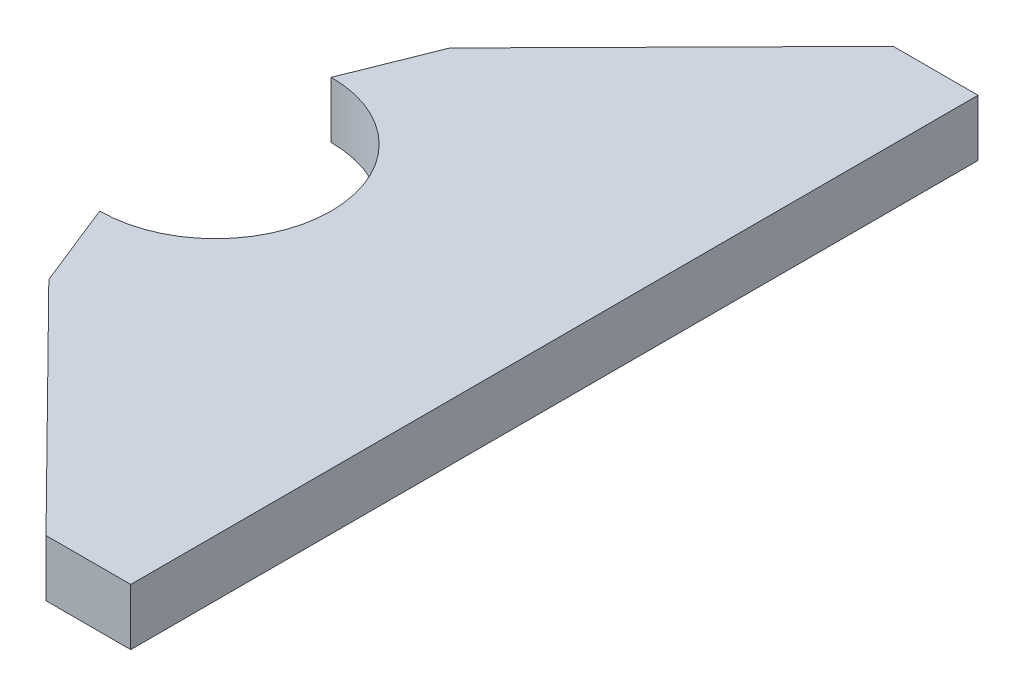
ISO-10303-21;
HEADER;
FILE_DESCRIPTION(('STEP AP214'),'2;1');
FILE_NAME('part.step','',(''),(''),'','','');
FILE_SCHEMA(('AUTOMOTIVE_DESIGN { 1 0 10303 214 1 1 1 1 }'));
ENDSEC;
DATA;
#1=APPLICATION_CONTEXT('core data for automotive mechanical design processes');
#2=APPLICATION_PROTOCOL_DEFINITION('international standard','automotive_design',2000,#1);
#3=PRODUCT_CONTEXT('',#1,'mechanical');
#4=PRODUCT('Part','Part','',(#3));
#5=PRODUCT_RELATED_PRODUCT_CATEGORY('part','',(#4));
#6=PRODUCT_DEFINITION_FORMATION('','',#4);
#7=PRODUCT_DEFINITION_CONTEXT('part definition',#1,'design');
#8=PRODUCT_DEFINITION('design','',#6,#7);
#9=PRODUCT_DEFINITION_SHAPE('','',#8);
#10=(LENGTH_UNIT() NAMED_UNIT(*) SI_UNIT(.MILLI.,.METRE.));
#11=(NAMED_UNIT(*) PLANE_ANGLE_UNIT() SI_UNIT($,.RADIAN.));
#12=(NAMED_UNIT(*) SI_UNIT($,.STERADIAN.) SOLID_ANGLE_UNIT());
#13=UNCERTAINTY_MEASURE_WITH_UNIT(LENGTH_MEASURE(1.E-05),#10,'distance_accuracy_value','');
#14=(GEOMETRIC_REPRESENTATION_CONTEXT(3) GLOBAL_UNCERTAINTY_ASSIGNED_CONTEXT((#13)) GLOBAL_UNIT_ASSIGNED_CONTEXT((#10,
#11,#12)) REPRESENTATION_CONTEXT('',''));
#15=CARTESIAN_POINT('',(0.,0.,0.));
#16=DIRECTION('',(0.,0.,1.));
#17=DIRECTION('',(1.,0.,0.));
#18=AXIS2_PLACEMENT_3D('',#15,#16,#17);
#19=CARTESIAN_POINT('',(56.5537084398977,10.,75.));
#20=DIRECTION('',(-1.,0.,0.));
#21=DIRECTION('',(0.,0.,1.));
#22=AXIS2_PLACEMENT_3D('',#19,#20,#21);
#23=PLANE('',#22);
#24=DIRECTION('',(0.,0.,-1.));
#25=VECTOR('',#24,1.);
#26=CARTESIAN_POINT('',(56.5537084398977,0.,75.));
#27=LINE('',#26,#25);
#28=CARTESIAN_POINT('',(56.5537084398977,0.,75.));
#29=VERTEX_POINT('',#28);
#30=CARTESIAN_POINT('',(56.5537084398977,0.,-75.));
#31=VERTEX_POINT('',#30);
#32=EDGE_CURVE('E130',#29,#31,#27,.T.);
#33=ORIENTED_EDGE('',*,*,#32,.T.);
#34=DIRECTION('',(0.,-1.,0.));
#35=VECTOR('',#34,1.);
#36=CARTESIAN_POINT('',(56.5537084398977,10.,-75.));
#37=LINE('',#36,#35);
#38=CARTESIAN_POINT('',(56.5537084398977,10.,-75.));
#39=VERTEX_POINT('',#38);
#40=EDGE_CURVE('E11',#39,#31,#37,.T.);
#41=ORIENTED_EDGE('',*,*,#40,.F.);
#42=DIRECTION('',(0.,0.,-1.));
#43=VECTOR('',#42,1.);
#44=CARTESIAN_POINT('',(56.5537084398977,10.,75.));
#45=LINE('',#44,#43);
#46=CARTESIAN_POINT('',(56.5537084398977,10.,75.));
#47=VERTEX_POINT('',#46);
#48=EDGE_CURVE('E144',#47,#39,#45,.T.);
#49=ORIENTED_EDGE('',*,*,#48,.F.);
#50=DIRECTION('',(0.,-1.,0.));
#51=VECTOR('',#50,1.);
#52=CARTESIAN_POINT('',(56.5537084398977,10.,75.));
#53=LINE('',#52,#51);
#54=EDGE_CURVE('E126',#47,#29,#53,.T.);
#55=ORIENTED_EDGE('',*,*,#54,.T.);
#56=EDGE_LOOP('',(#33,#41,#49,#55));
#57=FACE_BOUND('',#56,.T.);
#58=ADVANCED_FACE('F34',(#57),#23,.F.);
#59=CARTESIAN_POINT('',(41.5537084398977,10.,-75.));
#60=DIRECTION('',(0.,0.,1.));
#61=DIRECTION('',(1.,0.,0.));
#62=AXIS2_PLACEMENT_3D('',#59,#60,#61);
#63=PLANE('',#62);
#64=DIRECTION('',(-1.,0.,0.));
#65=VECTOR('',#64,1.);
#66=CARTESIAN_POINT('',(41.5537084398977,0.,-75.));
#67=LINE('',#66,#65);
#68=CARTESIAN_POINT('',(41.5537084398977,0.,-75.));
#69=VERTEX_POINT('',#68);
#70=EDGE_CURVE('E133',#31,#69,#67,.T.);
#71=ORIENTED_EDGE('',*,*,#70,.T.);
#72=DIRECTION('',(0.,-1.,0.));
#73=VECTOR('',#72,1.);
#74=CARTESIAN_POINT('',(41.5537084398977,10.,-75.));
#75=LINE('',#74,#73);
#76=CARTESIAN_POINT('',(41.5537084398977,10.,-75.));
#77=VERTEX_POINT('',#76);
#78=EDGE_CURVE('E42',#77,#69,#75,.T.);
#79=ORIENTED_EDGE('',*,*,#78,.F.);
#80=DIRECTION('',(-1.,0.,0.));
#81=VECTOR('',#80,1.);
#82=CARTESIAN_POINT('',(41.5537084398977,10.,-75.));
#83=LINE('',#82,#81);
#84=EDGE_CURVE('E93',#39,#77,#83,.T.);
#85=ORIENTED_EDGE('',*,*,#84,.F.);
#86=ORIENTED_EDGE('',*,*,#40,.T.);
#87=EDGE_LOOP('',(#71,#79,#85,#86));
#88=FACE_BOUND('',#87,.T.);
#89=ADVANCED_FACE('F179',(#88),#63,.F.);
#90=CARTESIAN_POINT('',(2.5537084398977,10.,-35.5));
#91=DIRECTION('',(0.711596211595451,0.,0.70258866461323));
#92=DIRECTION('',(0.70258866461323,0.,-0.711596211595451));
#93=AXIS2_PLACEMENT_3D('',#90,#91,#92);
#94=PLANE('',#93);
#95=DIRECTION('',(-0.70258866461323,0.,0.711596211595451));
#96=VECTOR('',#95,1.);
#97=CARTESIAN_POINT('',(2.5537084398977,0.,-35.5));
#98=LINE('',#97,#96);
#99=CARTESIAN_POINT('',(2.5537084398977,0.,-35.5));
#100=VERTEX_POINT('',#99);
#101=EDGE_CURVE('E135',#69,#100,#98,.T.);
#102=ORIENTED_EDGE('',*,*,#101,.T.);
#103=DIRECTION('',(0.,-1.,0.));
#104=VECTOR('',#103,1.);
#105=CARTESIAN_POINT('',(2.5537084398977,10.,-35.5));
#106=LINE('',#105,#104);
#107=CARTESIAN_POINT('',(2.5537084398977,10.,-35.5));
#108=VERTEX_POINT('',#107);
#109=EDGE_CURVE('E151',#108,#100,#106,.T.);
#110=ORIENTED_EDGE('',*,*,#109,.F.);
#111=DIRECTION('',(-0.70258866461323,0.,0.711596211595451));
#112=VECTOR('',#111,1.);
#113=CARTESIAN_POINT('',(2.5537084398977,10.,-35.5));
#114=LINE('',#113,#112);
#115=EDGE_CURVE('E159',#77,#108,#114,.T.);
#116=ORIENTED_EDGE('',*,*,#115,.F.);
#117=ORIENTED_EDGE('',*,*,#78,.T.);
#118=EDGE_LOOP('',(#102,#110,#116,#117));
#119=FACE_BOUND('',#118,.T.);
#120=ADVANCED_FACE('F157',(#119),#94,.F.);
#121=CARTESIAN_POINT('',(-3.4462915601023,10.,-20.5));
#122=DIRECTION('',(0.928476690885259,0.,0.371390676354104));
#123=DIRECTION('',(0.371390676354104,0.,-0.928476690885259));
#124=AXIS2_PLACEMENT_3D('',#121,#122,#123);
#125=PLANE('',#124);
#126=DIRECTION('',(-0.371390676354104,0.,0.928476690885259));
#127=VECTOR('',#126,1.);
#128=CARTESIAN_POINT('',(-3.4462915601023,0.,-20.5));
#129=LINE('',#128,#127);
#130=CARTESIAN_POINT('',(-3.4462915601023,0.,-20.5));
#131=VERTEX_POINT('',#130);
#132=EDGE_CURVE('E137',#100,#131,#129,.T.);
#133=ORIENTED_EDGE('',*,*,#132,.T.);
#134=DIRECTION('',(0.,-1.,0.));
#135=VECTOR('',#134,1.);
#136=CARTESIAN_POINT('',(-3.4462915601023,10.,-20.5));
#137=LINE('',#136,#135);
#138=CARTESIAN_POINT('',(-3.4462915601023,10.,-20.5));
#139=VERTEX_POINT('',#138);
#140=EDGE_CURVE('E148',#139,#131,#137,.T.);
#141=ORIENTED_EDGE('',*,*,#140,.F.);
#142=DIRECTION('',(-0.371390676354104,0.,0.928476690885259));
#143=VECTOR('',#142,1.);
#144=CARTESIAN_POINT('',(-3.4462915601023,10.,-20.5));
#145=LINE('',#144,#143);
#146=EDGE_CURVE('E171',#108,#139,#145,.T.);
#147=ORIENTED_EDGE('',*,*,#146,.F.);
#148=ORIENTED_EDGE('',*,*,#109,.T.);
#149=EDGE_LOOP('',(#133,#141,#147,#148));
#150=FACE_BOUND('',#149,.T.);
#151=ADVANCED_FACE('F167',(#150),#125,.F.);
#152=CARTESIAN_POINT('',(-3.4462915601023,10.,0.));
#153=DIRECTION('',(0.,-1.,0.));
#154=DIRECTION('',(0.,0.,-1.));
#155=AXIS2_PLACEMENT_3D('',#152,#153,#154);
#156=CYLINDRICAL_SURFACE('',#155,20.5);
#157=CARTESIAN_POINT('',(-3.4462915601023,0.,0.));
#158=DIRECTION('',(0.,-1.,0.));
#159=DIRECTION('',(0.,0.,1.));
#160=AXIS2_PLACEMENT_3D('',#157,#158,#159);
#161=CIRCLE('',#160,20.5);
#162=CARTESIAN_POINT('',(-3.4462915601023,0.,20.5));
#163=VERTEX_POINT('',#162);
#164=EDGE_CURVE('E139',#131,#163,#161,.T.);
#165=ORIENTED_EDGE('',*,*,#164,.T.);
#166=DIRECTION('',(0.,-1.,0.));
#167=VECTOR('',#166,1.);
#168=CARTESIAN_POINT('',(-3.4462915601023,10.,20.5));
#169=LINE('',#168,#167);
#170=CARTESIAN_POINT('',(-3.4462915601023,10.,20.5));
#171=VERTEX_POINT('',#170);
#172=EDGE_CURVE('E121',#171,#163,#169,.T.);
#173=ORIENTED_EDGE('',*,*,#172,.F.);
#174=CARTESIAN_POINT('',(-3.4462915601023,10.,0.));
#175=DIRECTION('',(0.,-1.,0.));
#176=DIRECTION('',(0.,0.,1.));
#177=AXIS2_PLACEMENT_3D('',#174,#175,#176);
#178=CIRCLE('',#177,20.5);
#179=EDGE_CURVE('E112',#139,#171,#178,.T.);
#180=ORIENTED_EDGE('',*,*,#179,.F.);
#181=ORIENTED_EDGE('',*,*,#140,.T.);
#182=EDGE_LOOP('',(#165,#173,#180,#181));
#183=FACE_BOUND('',#182,.T.);
#184=ADVANCED_FACE('F170',(#183),#156,.F.);
#185=CARTESIAN_POINT('',(-3.4462915601023,10.,20.5));
#186=DIRECTION('',(0.928476690885259,0.,-0.371390676354104));
#187=DIRECTION('',(-0.371390676354104,0.,-0.928476690885259));
#188=AXIS2_PLACEMENT_3D('',#185,#186,#187);
#189=PLANE('',#188);
#190=DIRECTION('',(0.371390676354104,0.,0.928476690885259));
#191=VECTOR('',#190,1.);
#192=CARTESIAN_POINT('',(-3.4462915601023,0.,20.5));
#193=LINE('',#192,#191);
#194=CARTESIAN_POINT('',(2.5537084398977,0.,35.5));
#195=VERTEX_POINT('',#194);
#196=EDGE_CURVE('E120',#163,#195,#193,.T.);
#197=ORIENTED_EDGE('',*,*,#196,.T.);
#198=DIRECTION('',(0.,-1.,0.));
#199=VECTOR('',#198,1.);
#200=CARTESIAN_POINT('',(2.5537084398977,10.,35.5));
#201=LINE('',#200,#199);
#202=CARTESIAN_POINT('',(2.5537084398977,10.,35.5));
#203=VERTEX_POINT('',#202);
#204=EDGE_CURVE('E117',#203,#195,#201,.T.);
#205=ORIENTED_EDGE('',*,*,#204,.F.);
#206=DIRECTION('',(0.371390676354104,0.,0.928476690885259));
#207=VECTOR('',#206,1.);
#208=CARTESIAN_POINT('',(-3.4462915601023,10.,20.5));
#209=LINE('',#208,#207);
#210=EDGE_CURVE('E106',#171,#203,#209,.T.);
#211=ORIENTED_EDGE('',*,*,#210,.F.);
#212=ORIENTED_EDGE('',*,*,#172,.T.);
#213=EDGE_LOOP('',(#197,#205,#211,#212));
#214=FACE_BOUND('',#213,.T.);
#215=ADVANCED_FACE('F118',(#214),#189,.F.);
#216=CARTESIAN_POINT('',(2.5537084398977,10.,35.5));
#217=DIRECTION('',(0.711596211595451,0.,-0.70258866461323));
#218=DIRECTION('',(-0.70258866461323,0.,-0.711596211595451));
#219=AXIS2_PLACEMENT_3D('',#216,#217,#218);
#220=PLANE('',#219);
#221=DIRECTION('',(0.70258866461323,0.,0.711596211595451));
#222=VECTOR('',#221,1.);
#223=CARTESIAN_POINT('',(2.5537084398977,0.,35.5));
#224=LINE('',#223,#222);
#225=CARTESIAN_POINT('',(41.5537084398977,0.,75.));
#226=VERTEX_POINT('',#225);
#227=EDGE_CURVE('E79',#195,#226,#224,.T.);
#228=ORIENTED_EDGE('',*,*,#227,.T.);
#229=DIRECTION('',(0.,-1.,0.));
#230=VECTOR('',#229,1.);
#231=CARTESIAN_POINT('',(41.5537084398977,10.,75.));
#232=LINE('',#231,#230);
#233=CARTESIAN_POINT('',(41.5537084398977,10.,75.));
#234=VERTEX_POINT('',#233);
#235=EDGE_CURVE('E122',#234,#226,#232,.T.);
#236=ORIENTED_EDGE('',*,*,#235,.F.);
#237=DIRECTION('',(0.70258866461323,0.,0.711596211595451));
#238=VECTOR('',#237,1.);
#239=CARTESIAN_POINT('',(2.5537084398977,10.,35.5));
#240=LINE('',#239,#238);
#241=EDGE_CURVE('E110',#203,#234,#240,.T.);
#242=ORIENTED_EDGE('',*,*,#241,.F.);
#243=ORIENTED_EDGE('',*,*,#204,.T.);
#244=EDGE_LOOP('',(#228,#236,#242,#243));
#245=FACE_BOUND('',#244,.T.);
#246=ADVANCED_FACE('F124',(#245),#220,.F.);
#247=CARTESIAN_POINT('',(41.5537084398977,10.,75.));
#248=DIRECTION('',(0.,0.,-1.));
#249=DIRECTION('',(-1.,0.,0.));
#250=AXIS2_PLACEMENT_3D('',#247,#248,#249);
#251=PLANE('',#250);
#252=DIRECTION('',(1.,0.,0.));
#253=VECTOR('',#252,1.);
#254=CARTESIAN_POINT('',(41.5537084398977,0.,75.));
#255=LINE('',#254,#253);
#256=EDGE_CURVE('E85',#226,#29,#255,.T.);
#257=ORIENTED_EDGE('',*,*,#256,.T.);
#258=ORIENTED_EDGE('',*,*,#54,.F.);
#259=DIRECTION('',(1.,0.,0.));
#260=VECTOR('',#259,1.);
#261=CARTESIAN_POINT('',(41.5537084398977,10.,75.));
#262=LINE('',#261,#260);
#263=EDGE_CURVE('E50',#234,#47,#262,.T.);
#264=ORIENTED_EDGE('',*,*,#263,.F.);
#265=ORIENTED_EDGE('',*,*,#235,.T.);
#266=EDGE_LOOP('',(#257,#258,#264,#265));
#267=FACE_BOUND('',#266,.T.);
#268=ADVANCED_FACE('F195',(#267),#251,.F.);
#269=CARTESIAN_POINT('',(-3.4462915601023,10.,0.));
#270=DIRECTION('',(0.,1.,0.));
#271=DIRECTION('',(0.,0.,1.));
#272=AXIS2_PLACEMENT_3D('',#269,#270,#271);
#273=PLANE('',#272);
#274=ORIENTED_EDGE('',*,*,#48,.T.);
#275=ORIENTED_EDGE('',*,*,#84,.T.);
#276=ORIENTED_EDGE('',*,*,#115,.T.);
#277=ORIENTED_EDGE('',*,*,#146,.T.);
#278=ORIENTED_EDGE('',*,*,#179,.T.);
#279=ORIENTED_EDGE('',*,*,#210,.T.);
#280=ORIENTED_EDGE('',*,*,#241,.T.);
#281=ORIENTED_EDGE('',*,*,#263,.T.);
#282=EDGE_LOOP('',(#274,#275,#276,#277,#278,#279,#280,#281));
#283=FACE_BOUND('',#282,.T.);
#284=ADVANCED_FACE('F108',(#283),#273,.T.);
#285=CARTESIAN_POINT('',(-3.4462915601023,0.,0.));
#286=DIRECTION('',(0.,1.,0.));
#287=DIRECTION('',(0.,0.,1.));
#288=AXIS2_PLACEMENT_3D('',#285,#286,#287);
#289=PLANE('',#288);
#290=ORIENTED_EDGE('',*,*,#32,.F.);
#291=ORIENTED_EDGE('',*,*,#256,.F.);
#292=ORIENTED_EDGE('',*,*,#227,.F.);
#293=ORIENTED_EDGE('',*,*,#196,.F.);
#294=ORIENTED_EDGE('',*,*,#164,.F.);
#295=ORIENTED_EDGE('',*,*,#132,.F.);
#296=ORIENTED_EDGE('',*,*,#101,.F.);
#297=ORIENTED_EDGE('',*,*,#70,.F.);
#298=EDGE_LOOP('',(#290,#291,#292,#293,#294,#295,#296,#297));
#299=FACE_BOUND('',#298,.T.);
#300=ADVANCED_FACE('F163',(#299),#289,.F.);
#301=CLOSED_SHELL('',(#58,#89,#120,#151,#184,#215,#246,#268,#284,#300));
#302=MANIFOLD_SOLID_BREP('B2',#301);
#303=ADVANCED_BREP_SHAPE_REPRESENTATION('',(#18,#302),#14);
#304=SHAPE_DEFINITION_REPRESENTATION(#9,#303);
ENDSEC;
END-ISO-10303-21;
